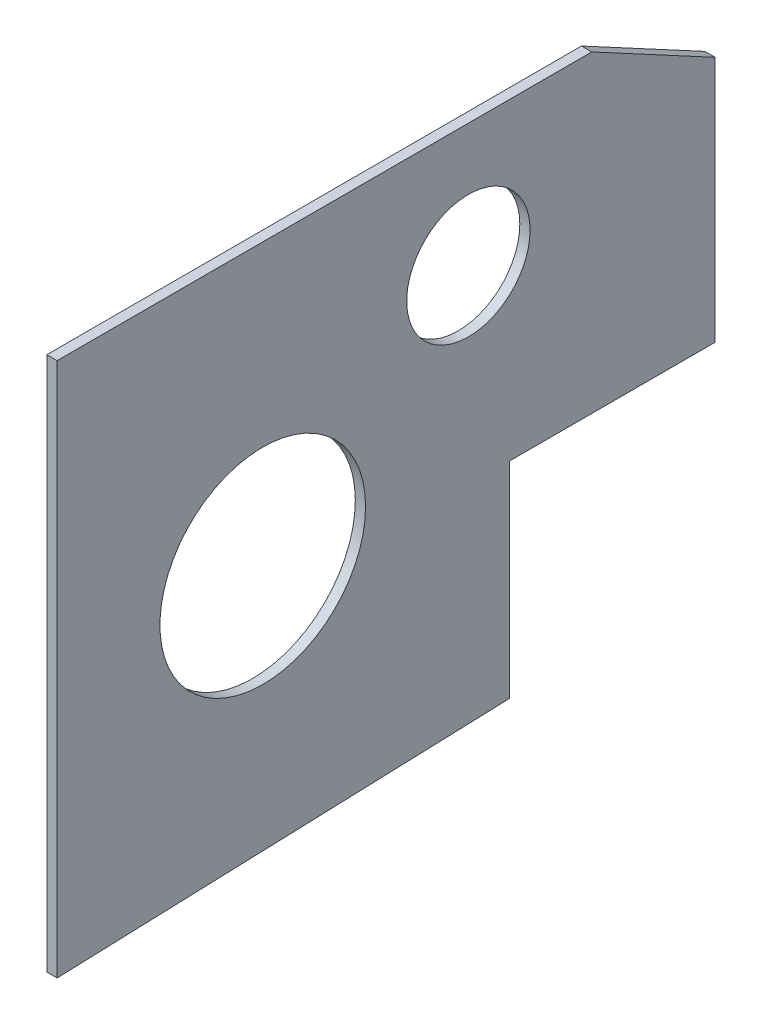
ISO-10303-21;
HEADER;
FILE_DESCRIPTION(('STEP AP214'),'2;1');
FILE_NAME('part.step','',(''),(''),'','','');
FILE_SCHEMA(('AUTOMOTIVE_DESIGN { 1 0 10303 214 1 1 1 1 }'));
ENDSEC;
DATA;
#1=APPLICATION_CONTEXT('core data for automotive mechanical design processes');
#2=APPLICATION_PROTOCOL_DEFINITION('international standard','automotive_design',2000,#1);
#3=PRODUCT_CONTEXT('',#1,'mechanical');
#4=PRODUCT('Part','Part','',(#3));
#5=PRODUCT_RELATED_PRODUCT_CATEGORY('part','',(#4));
#6=PRODUCT_DEFINITION_FORMATION('','',#4);
#7=PRODUCT_DEFINITION_CONTEXT('part definition',#1,'design');
#8=PRODUCT_DEFINITION('design','',#6,#7);
#9=PRODUCT_DEFINITION_SHAPE('','',#8);
#10=(LENGTH_UNIT() NAMED_UNIT(*) SI_UNIT(.MILLI.,.METRE.));
#11=(NAMED_UNIT(*) PLANE_ANGLE_UNIT() SI_UNIT($,.RADIAN.));
#12=(NAMED_UNIT(*) SI_UNIT($,.STERADIAN.) SOLID_ANGLE_UNIT());
#13=UNCERTAINTY_MEASURE_WITH_UNIT(LENGTH_MEASURE(1.E-05),#10,'distance_accuracy_value','');
#14=(GEOMETRIC_REPRESENTATION_CONTEXT(3) GLOBAL_UNCERTAINTY_ASSIGNED_CONTEXT((#13)) GLOBAL_UNIT_ASSIGNED_CONTEXT((#10,
#11,#12)) REPRESENTATION_CONTEXT('',''));
#15=CARTESIAN_POINT('',(0.,0.,0.));
#16=DIRECTION('',(0.,0.,1.));
#17=DIRECTION('',(1.,0.,0.));
#18=AXIS2_PLACEMENT_3D('',#15,#16,#17);
#19=CARTESIAN_POINT('',(3.175,-76.4124535315986,198.242750929368));
#20=DIRECTION('',(0.,-0.999382915534975,-0.0351253204513813));
#21=DIRECTION('',(0.,0.0351253204513814,-0.999382915534976));
#22=AXIS2_PLACEMENT_3D('',#19,#20,#21);
#23=PLANE('',#22);
#24=DIRECTION('',(0.,-0.0351253204513813,0.999382915534975));
#25=VECTOR('',#24,1.);
#26=CARTESIAN_POINT('',(0.,-76.4124535315986,198.242750929368));
#27=LINE('',#26,#25);
#28=CARTESIAN_POINT('',(0.,-76.4124535315986,198.242750929368));
#29=VERTEX_POINT('',#28);
#30=CARTESIAN_POINT('',(0.,-81.3224907063198,337.942750929368));
#31=VERTEX_POINT('',#30);
#32=EDGE_CURVE('E135',#29,#31,#27,.T.);
#33=ORIENTED_EDGE('',*,*,#32,.F.);
#34=DIRECTION('',(-1.,0.,0.));
#35=VECTOR('',#34,1.);
#36=CARTESIAN_POINT('',(3.175,-76.4124535315986,198.242750929368));
#37=LINE('',#36,#35);
#38=CARTESIAN_POINT('',(3.175,-76.4124535315986,198.242750929368));
#39=VERTEX_POINT('',#38);
#40=EDGE_CURVE('E11',#39,#29,#37,.T.);
#41=ORIENTED_EDGE('',*,*,#40,.F.);
#42=DIRECTION('',(0.,-0.0351253204513813,0.999382915534975));
#43=VECTOR('',#42,1.);
#44=CARTESIAN_POINT('',(3.175,-76.4124535315986,198.242750929368));
#45=LINE('',#44,#43);
#46=CARTESIAN_POINT('',(3.175,-81.3224907063198,337.942750929368));
#47=VERTEX_POINT('',#46);
#48=EDGE_CURVE('E160',#39,#47,#45,.T.);
#49=ORIENTED_EDGE('',*,*,#48,.T.);
#50=DIRECTION('',(-1.,0.,0.));
#51=VECTOR('',#50,1.);
#52=CARTESIAN_POINT('',(3.175,-81.3224907063198,337.942750929368));
#53=LINE('',#52,#51);
#54=EDGE_CURVE('E41',#47,#31,#53,.T.);
#55=ORIENTED_EDGE('',*,*,#54,.T.);
#56=EDGE_LOOP('',(#33,#41,#49,#55));
#57=FACE_BOUND('',#56,.T.);
#58=ADVANCED_FACE('F38',(#57),#23,.T.);
#59=CARTESIAN_POINT('',(3.175,-12.9124535315986,198.242750929368));
#60=DIRECTION('',(0.,0.,-1.));
#61=DIRECTION('',(-1.,0.,0.));
#62=AXIS2_PLACEMENT_3D('',#59,#60,#61);
#63=PLANE('',#62);
#64=DIRECTION('',(0.,-1.,0.));
#65=VECTOR('',#64,1.);
#66=CARTESIAN_POINT('',(0.,-12.9124535315986,198.242750929368));
#67=LINE('',#66,#65);
#68=CARTESIAN_POINT('',(0.,-12.9124535315986,198.242750929368));
#69=VERTEX_POINT('',#68);
#70=EDGE_CURVE('E157',#69,#29,#67,.T.);
#71=ORIENTED_EDGE('',*,*,#70,.F.);
#72=DIRECTION('',(-1.,0.,0.));
#73=VECTOR('',#72,1.);
#74=CARTESIAN_POINT('',(3.175,-12.9124535315986,198.242750929368));
#75=LINE('',#74,#73);
#76=CARTESIAN_POINT('',(3.175,-12.9124535315986,198.242750929368));
#77=VERTEX_POINT('',#76);
#78=EDGE_CURVE('E48',#77,#69,#75,.T.);
#79=ORIENTED_EDGE('',*,*,#78,.F.);
#80=DIRECTION('',(0.,-1.,0.));
#81=VECTOR('',#80,1.);
#82=CARTESIAN_POINT('',(3.175,-12.9124535315986,198.242750929368));
#83=LINE('',#82,#81);
#84=EDGE_CURVE('E121',#77,#39,#83,.T.);
#85=ORIENTED_EDGE('',*,*,#84,.T.);
#86=ORIENTED_EDGE('',*,*,#40,.T.);
#87=EDGE_LOOP('',(#71,#79,#85,#86));
#88=FACE_BOUND('',#87,.T.);
#89=ADVANCED_FACE('F175',(#88),#63,.T.);
#90=CARTESIAN_POINT('',(3.175,-12.9124535315986,134.742750929368));
#91=DIRECTION('',(0.,-1.,0.));
#92=DIRECTION('',(0.,0.,-1.));
#93=AXIS2_PLACEMENT_3D('',#90,#91,#92);
#94=PLANE('',#93);
#95=DIRECTION('',(0.,0.,1.));
#96=VECTOR('',#95,1.);
#97=CARTESIAN_POINT('',(0.,-12.9124535315986,134.742750929368));
#98=LINE('',#97,#96);
#99=CARTESIAN_POINT('',(0.,-12.9124535315986,134.742750929368));
#100=VERTEX_POINT('',#99);
#101=EDGE_CURVE('E107',#100,#69,#98,.T.);
#102=ORIENTED_EDGE('',*,*,#101,.F.);
#103=DIRECTION('',(-1.,0.,0.));
#104=VECTOR('',#103,1.);
#105=CARTESIAN_POINT('',(3.175,-12.9124535315986,134.742750929368));
#106=LINE('',#105,#104);
#107=CARTESIAN_POINT('',(3.175,-12.9124535315986,134.742750929368));
#108=VERTEX_POINT('',#107);
#109=EDGE_CURVE('E102',#108,#100,#106,.T.);
#110=ORIENTED_EDGE('',*,*,#109,.F.);
#111=DIRECTION('',(0.,0.,1.));
#112=VECTOR('',#111,1.);
#113=CARTESIAN_POINT('',(3.175,-12.9124535315986,134.742750929368));
#114=LINE('',#113,#112);
#115=EDGE_CURVE('E105',#108,#77,#114,.T.);
#116=ORIENTED_EDGE('',*,*,#115,.T.);
#117=ORIENTED_EDGE('',*,*,#78,.T.);
#118=EDGE_LOOP('',(#102,#110,#116,#117));
#119=FACE_BOUND('',#118,.T.);
#120=ADVANCED_FACE('F104',(#119),#94,.T.);
#121=CARTESIAN_POINT('',(3.175,63.2875464684014,134.742750929368));
#122=DIRECTION('',(0.,0.,-1.));
#123=DIRECTION('',(-1.,0.,0.));
#124=AXIS2_PLACEMENT_3D('',#121,#122,#123);
#125=PLANE('',#124);
#126=DIRECTION('',(0.,-1.,0.));
#127=VECTOR('',#126,1.);
#128=CARTESIAN_POINT('',(0.,63.2875464684014,134.742750929368));
#129=LINE('',#128,#127);
#130=CARTESIAN_POINT('',(0.,63.2875464684014,134.742750929368));
#131=VERTEX_POINT('',#130);
#132=EDGE_CURVE('E152',#131,#100,#129,.T.);
#133=ORIENTED_EDGE('',*,*,#132,.F.);
#134=DIRECTION('',(-1.,0.,0.));
#135=VECTOR('',#134,1.);
#136=CARTESIAN_POINT('',(3.175,63.2875464684014,134.742750929368));
#137=LINE('',#136,#135);
#138=CARTESIAN_POINT('',(3.175,63.2875464684014,134.742750929368));
#139=VERTEX_POINT('',#138);
#140=EDGE_CURVE('E113',#139,#131,#137,.T.);
#141=ORIENTED_EDGE('',*,*,#140,.F.);
#142=DIRECTION('',(0.,-1.,0.));
#143=VECTOR('',#142,1.);
#144=CARTESIAN_POINT('',(3.175,63.2875464684014,134.742750929368));
#145=LINE('',#144,#143);
#146=EDGE_CURVE('E119',#139,#108,#145,.T.);
#147=ORIENTED_EDGE('',*,*,#146,.T.);
#148=ORIENTED_EDGE('',*,*,#109,.T.);
#149=EDGE_LOOP('',(#133,#141,#147,#148));
#150=FACE_BOUND('',#149,.T.);
#151=ADVANCED_FACE('F124',(#150),#125,.T.);
#152=CARTESIAN_POINT('',(3.175,83.7775092936803,172.842750929368));
#153=DIRECTION('',(0.,0.880716284625442,-0.473644197679606));
#154=DIRECTION('',(0.,0.473644197679606,0.880716284625442));
#155=AXIS2_PLACEMENT_3D('',#152,#153,#154);
#156=PLANE('',#155);
#157=DIRECTION('',(0.,-0.473644197679606,-0.880716284625442));
#158=VECTOR('',#157,1.);
#159=CARTESIAN_POINT('',(0.,83.7775092936803,172.842750929368));
#160=LINE('',#159,#158);
#161=CARTESIAN_POINT('',(0.,83.7775092936803,172.842750929368));
#162=VERTEX_POINT('',#161);
#163=EDGE_CURVE('E148',#162,#131,#160,.T.);
#164=ORIENTED_EDGE('',*,*,#163,.F.);
#165=DIRECTION('',(-1.,0.,0.));
#166=VECTOR('',#165,1.);
#167=CARTESIAN_POINT('',(3.175,83.7775092936803,172.842750929368));
#168=LINE('',#167,#166);
#169=CARTESIAN_POINT('',(3.175,83.7775092936803,172.842750929368));
#170=VERTEX_POINT('',#169);
#171=EDGE_CURVE('E166',#170,#162,#168,.T.);
#172=ORIENTED_EDGE('',*,*,#171,.F.);
#173=DIRECTION('',(0.,-0.473644197679606,-0.880716284625442));
#174=VECTOR('',#173,1.);
#175=CARTESIAN_POINT('',(3.175,83.7775092936803,172.842750929368));
#176=LINE('',#175,#174);
#177=EDGE_CURVE('E126',#170,#139,#176,.T.);
#178=ORIENTED_EDGE('',*,*,#177,.T.);
#179=ORIENTED_EDGE('',*,*,#140,.T.);
#180=EDGE_LOOP('',(#164,#172,#178,#179));
#181=FACE_BOUND('',#180,.T.);
#182=ADVANCED_FACE('F188',(#181),#156,.T.);
#183=CARTESIAN_POINT('',(3.175,83.7775092936803,337.942750929368));
#184=DIRECTION('',(0.,1.,0.));
#185=DIRECTION('',(0.,0.,1.));
#186=AXIS2_PLACEMENT_3D('',#183,#184,#185);
#187=PLANE('',#186);
#188=DIRECTION('',(0.,0.,-1.));
#189=VECTOR('',#188,1.);
#190=CARTESIAN_POINT('',(0.,83.7775092936803,337.942750929368));
#191=LINE('',#190,#189);
#192=CARTESIAN_POINT('',(0.,83.7775092936803,337.942750929368));
#193=VERTEX_POINT('',#192);
#194=EDGE_CURVE('E144',#193,#162,#191,.T.);
#195=ORIENTED_EDGE('',*,*,#194,.F.);
#196=DIRECTION('',(-1.,0.,0.));
#197=VECTOR('',#196,1.);
#198=CARTESIAN_POINT('',(3.175,83.7775092936803,337.942750929368));
#199=LINE('',#198,#197);
#200=CARTESIAN_POINT('',(3.175,83.7775092936803,337.942750929368));
#201=VERTEX_POINT('',#200);
#202=EDGE_CURVE('E168',#201,#193,#199,.T.);
#203=ORIENTED_EDGE('',*,*,#202,.F.);
#204=DIRECTION('',(0.,0.,-1.));
#205=VECTOR('',#204,1.);
#206=CARTESIAN_POINT('',(3.175,83.7775092936803,337.942750929368));
#207=LINE('',#206,#205);
#208=EDGE_CURVE('E129',#201,#170,#207,.T.);
#209=ORIENTED_EDGE('',*,*,#208,.T.);
#210=ORIENTED_EDGE('',*,*,#171,.T.);
#211=EDGE_LOOP('',(#195,#203,#209,#210));
#212=FACE_BOUND('',#211,.T.);
#213=ADVANCED_FACE('F191',(#212),#187,.T.);
#214=CARTESIAN_POINT('',(3.175,-81.3224907063198,337.942750929368));
#215=DIRECTION('',(0.,0.,1.));
#216=DIRECTION('',(1.,0.,0.));
#217=AXIS2_PLACEMENT_3D('',#214,#215,#216);
#218=PLANE('',#217);
#219=DIRECTION('',(0.,1.,0.));
#220=VECTOR('',#219,1.);
#221=CARTESIAN_POINT('',(0.,-81.3224907063198,337.942750929368));
#222=LINE('',#221,#220);
#223=EDGE_CURVE('E139',#31,#193,#222,.T.);
#224=ORIENTED_EDGE('',*,*,#223,.F.);
#225=ORIENTED_EDGE('',*,*,#54,.F.);
#226=DIRECTION('',(0.,1.,0.));
#227=VECTOR('',#226,1.);
#228=CARTESIAN_POINT('',(3.175,-81.3224907063198,337.942750929368));
#229=LINE('',#228,#227);
#230=EDGE_CURVE('E236',#47,#201,#229,.T.);
#231=ORIENTED_EDGE('',*,*,#230,.T.);
#232=ORIENTED_EDGE('',*,*,#202,.T.);
#233=EDGE_LOOP('',(#224,#225,#231,#232));
#234=FACE_BOUND('',#233,.T.);
#235=ADVANCED_FACE('F172',(#234),#218,.T.);
#236=CARTESIAN_POINT('',(3.175,0.,0.));
#237=DIRECTION('',(-1.,0.,0.));
#238=DIRECTION('',(0.,0.,1.));
#239=AXIS2_PLACEMENT_3D('',#236,#237,#238);
#240=PLANE('',#239);
#241=CARTESIAN_POINT('',(3.175,45.6775092936802,210.942750929368));
#242=DIRECTION('',(1.,0.,0.));
#243=DIRECTION('',(0.,0.,-1.));
#244=AXIS2_PLACEMENT_3D('',#241,#242,#243);
#245=CIRCLE('',#244,19.05);
#246=CARTESIAN_POINT('',(3.175,45.6775092936802,191.892750929368));
#247=VERTEX_POINT('',#246);
#248=EDGE_CURVE('E220',#247,#247,#245,.T.);
#249=ORIENTED_EDGE('',*,*,#248,.F.);
#250=EDGE_LOOP('',(#249));
#251=FACE_BOUND('',#250,.T.);
#252=CARTESIAN_POINT('',(3.175,-2.84360475630484,274.442750929368));
#253=DIRECTION('',(1.,0.,0.));
#254=DIRECTION('',(0.,0.,-1.));
#255=AXIS2_PLACEMENT_3D('',#252,#253,#254);
#256=CIRCLE('',#255,31.75);
#257=CARTESIAN_POINT('',(3.175,-2.84360475630484,242.692750929368));
#258=VERTEX_POINT('',#257);
#259=EDGE_CURVE('E222',#258,#258,#256,.T.);
#260=ORIENTED_EDGE('',*,*,#259,.F.);
#261=EDGE_LOOP('',(#260));
#262=FACE_BOUND('',#261,.T.);
#263=ORIENTED_EDGE('',*,*,#48,.F.);
#264=ORIENTED_EDGE('',*,*,#84,.F.);
#265=ORIENTED_EDGE('',*,*,#115,.F.);
#266=ORIENTED_EDGE('',*,*,#146,.F.);
#267=ORIENTED_EDGE('',*,*,#177,.F.);
#268=ORIENTED_EDGE('',*,*,#208,.F.);
#269=ORIENTED_EDGE('',*,*,#230,.F.);
#270=EDGE_LOOP('',(#263,#264,#265,#266,#267,#268,#269));
#271=FACE_BOUND('',#270,.T.);
#272=ADVANCED_FACE('F117',(#251,#262,#271),#240,.F.);
#273=CARTESIAN_POINT('',(0.,0.,0.));
#274=DIRECTION('',(-1.,0.,0.));
#275=DIRECTION('',(0.,0.,1.));
#276=AXIS2_PLACEMENT_3D('',#273,#274,#275);
#277=PLANE('',#276);
#278=CARTESIAN_POINT('',(0.,45.6775092936802,210.942750929368));
#279=DIRECTION('',(1.,0.,0.));
#280=DIRECTION('',(0.,0.,-1.));
#281=AXIS2_PLACEMENT_3D('',#278,#279,#280);
#282=CIRCLE('',#281,19.05);
#283=CARTESIAN_POINT('',(0.,45.6775092936802,191.892750929368));
#284=VERTEX_POINT('',#283);
#285=EDGE_CURVE('E140',#284,#284,#282,.T.);
#286=ORIENTED_EDGE('',*,*,#285,.T.);
#287=EDGE_LOOP('',(#286));
#288=FACE_BOUND('',#287,.T.);
#289=CARTESIAN_POINT('',(0.,-2.84360475630484,274.442750929368));
#290=DIRECTION('',(1.,0.,0.));
#291=DIRECTION('',(0.,0.,-1.));
#292=AXIS2_PLACEMENT_3D('',#289,#290,#291);
#293=CIRCLE('',#292,31.75);
#294=CARTESIAN_POINT('',(0.,-2.84360475630484,242.692750929368));
#295=VERTEX_POINT('',#294);
#296=EDGE_CURVE('E228',#295,#295,#293,.T.);
#297=ORIENTED_EDGE('',*,*,#296,.T.);
#298=EDGE_LOOP('',(#297));
#299=FACE_BOUND('',#298,.T.);
#300=ORIENTED_EDGE('',*,*,#32,.T.);
#301=ORIENTED_EDGE('',*,*,#223,.T.);
#302=ORIENTED_EDGE('',*,*,#194,.T.);
#303=ORIENTED_EDGE('',*,*,#163,.T.);
#304=ORIENTED_EDGE('',*,*,#132,.T.);
#305=ORIENTED_EDGE('',*,*,#101,.T.);
#306=ORIENTED_EDGE('',*,*,#70,.T.);
#307=EDGE_LOOP('',(#300,#301,#302,#303,#304,#305,#306));
#308=FACE_BOUND('',#307,.T.);
#309=ADVANCED_FACE('F174',(#288,#299,#308),#277,.T.);
#310=CARTESIAN_POINT('',(0.,-2.84360475630484,274.442750929368));
#311=DIRECTION('',(1.,0.,0.));
#312=DIRECTION('',(0.,0.,-1.));
#313=AXIS2_PLACEMENT_3D('',#310,#311,#312);
#314=CYLINDRICAL_SURFACE('',#313,31.75);
#315=ORIENTED_EDGE('',*,*,#296,.F.);
#316=EDGE_LOOP('',(#315));
#317=FACE_BOUND('',#316,.T.);
#318=ORIENTED_EDGE('',*,*,#259,.T.);
#319=EDGE_LOOP('',(#318));
#320=FACE_BOUND('',#319,.T.);
#321=ADVANCED_FACE('F203',(#317,#320),#314,.F.);
#322=CARTESIAN_POINT('',(0.,45.6775092936802,210.942750929368));
#323=DIRECTION('',(1.,0.,0.));
#324=DIRECTION('',(0.,0.,-1.));
#325=AXIS2_PLACEMENT_3D('',#322,#323,#324);
#326=CYLINDRICAL_SURFACE('',#325,19.05);
#327=ORIENTED_EDGE('',*,*,#285,.F.);
#328=EDGE_LOOP('',(#327));
#329=FACE_BOUND('',#328,.T.);
#330=ORIENTED_EDGE('',*,*,#248,.T.);
#331=EDGE_LOOP('',(#330));
#332=FACE_BOUND('',#331,.T.);
#333=ADVANCED_FACE('F210',(#329,#332),#326,.F.);
#334=CLOSED_SHELL('',(#58,#89,#120,#151,#182,#213,#235,#272,#309,#321,#333));
#335=MANIFOLD_SOLID_BREP('B2',#334);
#336=ADVANCED_BREP_SHAPE_REPRESENTATION('',(#18,#335),#14);
#337=SHAPE_DEFINITION_REPRESENTATION(#9,#336);
ENDSEC;
END-ISO-10303-21;
